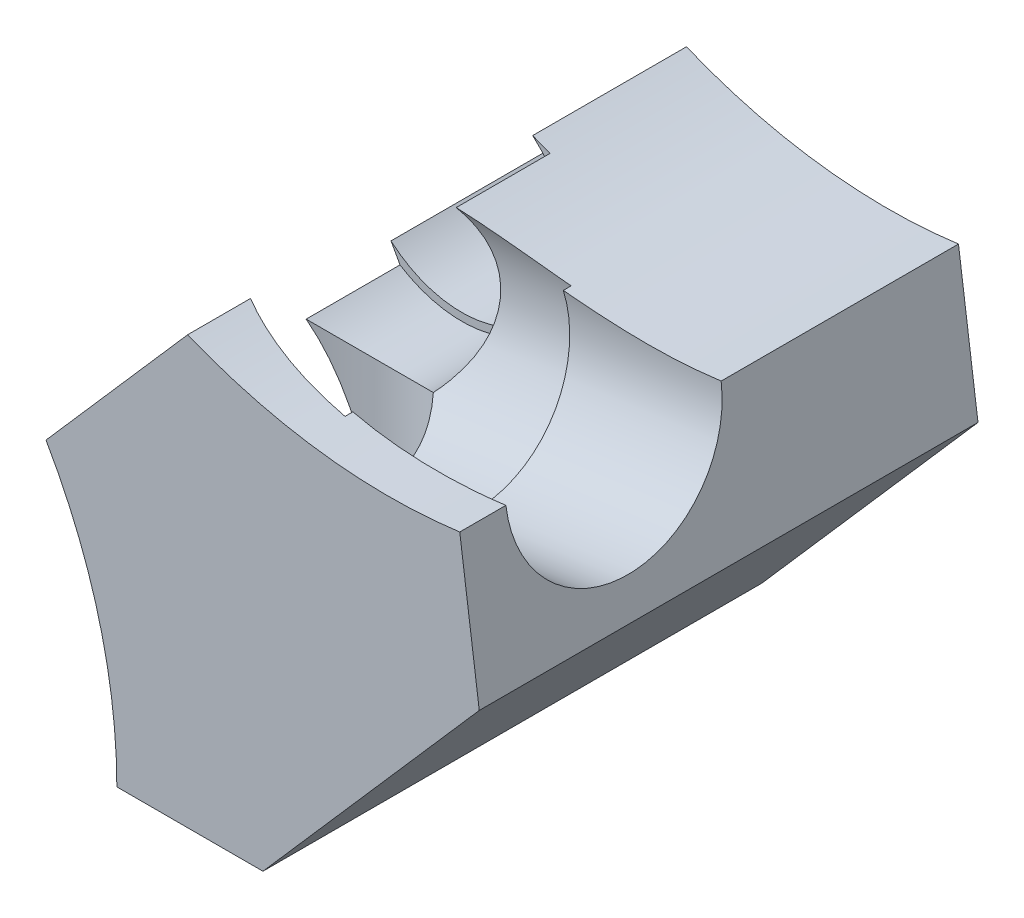
ISO-10303-21;
HEADER;
FILE_DESCRIPTION(('STEP AP214'),'2;1');
FILE_NAME('part.step','',(''),(''),'','','');
FILE_SCHEMA(('AUTOMOTIVE_DESIGN { 1 0 10303 214 1 1 1 1 }'));
ENDSEC;
DATA;
#1=APPLICATION_CONTEXT('core data for automotive mechanical design processes');
#2=APPLICATION_PROTOCOL_DEFINITION('international standard','automotive_design',2000,#1);
#3=PRODUCT_CONTEXT('',#1,'mechanical');
#4=PRODUCT('Part','Part','',(#3));
#5=PRODUCT_RELATED_PRODUCT_CATEGORY('part','',(#4));
#6=PRODUCT_DEFINITION_FORMATION('','',#4);
#7=PRODUCT_DEFINITION_CONTEXT('part definition',#1,'design');
#8=PRODUCT_DEFINITION('design','',#6,#7);
#9=PRODUCT_DEFINITION_SHAPE('','',#8);
#10=(LENGTH_UNIT() NAMED_UNIT(*) SI_UNIT(.MILLI.,.METRE.));
#11=(NAMED_UNIT(*) PLANE_ANGLE_UNIT() SI_UNIT($,.RADIAN.));
#12=(NAMED_UNIT(*) SI_UNIT($,.STERADIAN.) SOLID_ANGLE_UNIT());
#13=UNCERTAINTY_MEASURE_WITH_UNIT(LENGTH_MEASURE(1.E-05),#10,'distance_accuracy_value','');
#14=(GEOMETRIC_REPRESENTATION_CONTEXT(3) GLOBAL_UNCERTAINTY_ASSIGNED_CONTEXT((#13)) GLOBAL_UNIT_ASSIGNED_CONTEXT((#10,
#11,#12)) REPRESENTATION_CONTEXT('',''));
#15=CARTESIAN_POINT('',(0.,0.,0.));
#16=DIRECTION('',(0.,0.,1.));
#17=DIRECTION('',(1.,0.,0.));
#18=AXIS2_PLACEMENT_3D('',#15,#16,#17);
#19=CARTESIAN_POINT('',(-13.3940707922051,62.2917669045597,14.6326106220572));
#20=DIRECTION('',(0.,-1.,0.));
#21=DIRECTION('',(0.,0.,-1.));
#22=AXIS2_PLACEMENT_3D('',#19,#20,#21);
#23=CYLINDRICAL_SURFACE('',#22,15.);
#24=CARTESIAN_POINT('',(-13.3940707922051,62.2917669045588,14.6326106220572));
#25=DIRECTION('',(-0.752857241628755,0.658183844930231,0.));
#26=DIRECTION('',(-0.658183844930231,-0.752857241628755,0.));
#27=AXIS2_PLACEMENT_3D('',#24,#25,#26);
#28=ELLIPSE('',#27,22.7899850711013,15.);
#29=CARTESIAN_POINT('',(-13.3940707922042,62.2917669045598,29.6326106220572));
#30=VERTEX_POINT('',#29);
#31=CARTESIAN_POINT('',(-22.6086446212279,51.7517655217567,26.4686415931847));
#32=VERTEX_POINT('',#31);
#33=EDGE_CURVE('E182',#30,#32,#28,.F.);
#34=ORIENTED_EDGE('',*,*,#33,.F.);
#35=CARTESIAN_POINT('',(1.60592920779491,49.1780487545007,14.6326106220572));
#36=CARTESIAN_POINT('',(1.60592920779501,49.1780487545005,23.4194071864609));
#37=CARTESIAN_POINT('',(-4.60727422780116,54.6099286653931,29.6326106220573));
#38=CARTESIAN_POINT('',(-13.3940707922043,62.2917669045597,29.6326106220572));
#39=(BOUNDED_CURVE() B_SPLINE_CURVE(3,(#35,#36,#37,#38),.UNSPECIFIED.,.F.,
.F.) B_SPLINE_CURVE_WITH_KNOTS((4,4),(0.,1.57079632679487),
.UNSPECIFIED.) CURVE() GEOMETRIC_REPRESENTATION_ITEM() RATIONAL_B_SPLINE_CURVE((1.,
0.804737854124374,0.804737854124374,1.)) REPRESENTATION_ITEM(''));
#40=CARTESIAN_POINT('',(1.60592920779491,49.1780487545007,14.6326106220572));
#41=VERTEX_POINT('',#40);
#42=EDGE_CURVE('E343',#41,#30,#39,.T.);
#43=ORIENTED_EDGE('',*,*,#42,.F.);
#44=CARTESIAN_POINT('',(-2.10121216777219,52.4190092306077,4.75985294810577));
#45=CARTESIAN_POINT('',(0.315301500164727,50.3063772874685,7.52395879545354));
#46=CARTESIAN_POINT('',(1.60592920779509,49.1780487545009,10.9611232609637));
#47=CARTESIAN_POINT('',(1.60592920779491,49.1780487545007,14.6326106220572));
#48=(BOUNDED_CURVE() B_SPLINE_CURVE(3,(#44,#45,#46,#47),.UNSPECIFIED.,.F.,
.F.) B_SPLINE_CURVE_WITH_KNOTS((4,4),(5.56478144772367,6.28318530717959),
.UNSPECIFIED.) CURVE() GEOMETRIC_REPRESENTATION_ITEM() RATIONAL_B_SPLINE_CURVE((1.,
0.957451776798256,0.957451776798256,1.)) REPRESENTATION_ITEM(''));
#49=CARTESIAN_POINT('',(-2.10121216777219,52.4190092306077,4.75985294810577));
#50=VERTEX_POINT('',#49);
#51=EDGE_CURVE('E391',#50,#41,#48,.T.);
#52=ORIENTED_EDGE('',*,*,#51,.F.);
#53=CARTESIAN_POINT('',(-13.3940707922051,47.2917669045597,-0.367389377942728));
#54=CARTESIAN_POINT('',(-8.99778766191862,47.2917669045599,-0.367389377942724));
#55=CARTESIAN_POINT('',(-4.99477470186557,49.1092356397213,1.45007935721872));
#56=CARTESIAN_POINT('',(-2.10121216777219,52.4190092306077,4.75985294810577));
#57=(BOUNDED_CURVE() B_SPLINE_CURVE(3,(#53,#54,#55,#56),.UNSPECIFIED.,.F.,
.F.) B_SPLINE_CURVE_WITH_KNOTS((4,4),(0.,0.852392467338988),
.UNSPECIFIED.) CURVE() GEOMETRIC_REPRESENTATION_ITEM() RATIONAL_B_SPLINE_CURVE((1.,
0.940363232822113,0.940363232822113,1.)) REPRESENTATION_ITEM(''));
#58=CARTESIAN_POINT('',(-13.3940707922051,47.2917669045597,-0.36738937794123));
#59=VERTEX_POINT('',#58);
#60=EDGE_CURVE('E390',#59,#50,#57,.T.);
#61=ORIENTED_EDGE('',*,*,#60,.F.);
#62=CARTESIAN_POINT('',(-13.3940707922051,62.2917669045597,14.6326106220572));
#63=DIRECTION('',(0.,0.707106781186547,-0.707106781186547));
#64=DIRECTION('',(0.,-0.707106781186547,-0.707106781186547));
#65=AXIS2_PLACEMENT_3D('',#62,#63,#64);
#66=ELLIPSE('',#65,21.2132034355964,15.);
#67=CARTESIAN_POINT('',(-21.4352763002352,49.6292626507548,1.97010636825238));
#68=VERTEX_POINT('',#67);
#69=EDGE_CURVE('E388',#68,#59,#66,.F.);
#70=ORIENTED_EDGE('',*,*,#69,.F.);
#71=CARTESIAN_POINT('',(-22.6086446212279,51.7517655217567,2.79657965092977));
#72=CARTESIAN_POINT('',(-22.497305660859,51.5584649721213,2.70990399080437));
#73=CARTESIAN_POINT('',(-22.3863662625454,51.3636874077556,2.62605442565893));
#74=CARTESIAN_POINT('',(-22.1654630328847,50.971378048911,2.4637371655503));
#75=CARTESIAN_POINT('',(-22.0554991240742,50.7738464763895,2.3852690398565));
#76=CARTESIAN_POINT('',(-21.7274208095606,50.1775775529239,2.15758917954709));
#77=CARTESIAN_POINT('',(-21.511005245371,49.774967301797,2.01601360862565));
#78=CARTESIAN_POINT('',(-21.0843020626396,48.9616425290627,1.75149181491057));
#79=CARTESIAN_POINT('',(-20.874003201102,48.5509455552562,1.62850940463872));
#80=CARTESIAN_POINT('',(-20.4599243764826,47.7217042206528,1.3989506956497));
#81=CARTESIAN_POINT('',(-20.2561452329978,47.3031588836425,1.29237645324147));
#82=CARTESIAN_POINT('',(-19.8580629355517,46.4639160789752,1.09504808535267));
#83=CARTESIAN_POINT('',(-19.663679317475,46.0432949716763,1.00413042997038));
#84=CARTESIAN_POINT('',(-19.2825047777737,45.1960680174108,0.835154142728552));
#85=CARTESIAN_POINT('',(-19.0957141186502,44.7694619642195,0.757095955157812));
#86=CARTESIAN_POINT('',(-18.7300895004456,43.9107833320251,0.612426394373202));
#87=CARTESIAN_POINT('',(-18.5512580555866,43.4787090802678,0.545818619455417));
#88=CARTESIAN_POINT('',(-18.2019469766476,42.6097843647507,0.422803703924258));
#89=CARTESIAN_POINT('',(-18.0314670456592,42.1729340714624,0.36639620048421));
#90=CARTESIAN_POINT('',(-17.7274980351042,41.3699061091122,0.271474247942497));
#91=CARTESIAN_POINT('',(-17.5926642619812,41.0044016107723,0.231549220576216));
#92=CARTESIAN_POINT('',(-17.3290686501151,40.2707612929407,0.157302928381071));
#93=CARTESIAN_POINT('',(-17.2003051271107,39.9026262363636,0.1229801025707));
#94=CARTESIAN_POINT('',(-16.9483232080454,39.1621122344979,0.0592008036781349));
#95=CARTESIAN_POINT('',(-16.8251335798368,38.7897214912739,0.0297678541339318));
#96=CARTESIAN_POINT('',(-16.5849970314368,38.0425022593602,-0.0245749986940685));
#97=CARTESIAN_POINT('',(-16.4680516487505,37.6676731955443,-0.0494837915990582));
#98=CARTESIAN_POINT('',(-16.354284538196,37.2917669045596,-0.0723931038194329));
#99=B_SPLINE_CURVE_WITH_KNOTS('',3,(#71,#72,#73,#74,#75,#76,#77,#78,#79,#80,#81,#82,#83,#84,#85,
#86,#87,#88,#89,#90,#91,#92,#93,#94,#95,#96,#97,#98),.UNSPECIFIED.,.F.,.F.,(4,2,2,2,2,2,2,2,2,2,
2,2,2,4),(0.,0.717910663643234,1.43576379846521,2.87073353386964,4.30287343268334,
5.73519266469019,7.15150049011256,8.56785723807266,9.98465826620679,11.4014088883919,
12.5761788902568,13.7506209966783,14.9305588706972,16.110785950613),.UNSPECIFIED.);
#100=CARTESIAN_POINT('',(-16.354284538196,37.2917669045597,-0.0723931038194361));
#101=VERTEX_POINT('',#100);
#102=EDGE_CURVE('E238',#68,#101,#99,.T.);
#103=ORIENTED_EDGE('',*,*,#102,.T.);
#104=CARTESIAN_POINT('',(-13.3940707922051,37.2917669045597,14.6326106220572));
#105=DIRECTION('',(0.,1.,0.));
#106=DIRECTION('',(0.,0.,1.));
#107=AXIS2_PLACEMENT_3D('',#104,#105,#106);
#108=CIRCLE('',#107,15.);
#109=CARTESIAN_POINT('',(-16.354284538196,37.2917669045597,29.3376143479339));
#110=VERTEX_POINT('',#109);
#111=EDGE_CURVE('E373',#101,#110,#108,.F.);
#112=ORIENTED_EDGE('',*,*,#111,.T.);
#113=CARTESIAN_POINT('',(-16.354284538196,37.2917669045597,29.3376143479339));
#114=CARTESIAN_POINT('',(-16.4517083729152,37.613668672389,29.3179994798801));
#115=CARTESIAN_POINT('',(-16.5514584807857,37.9347711177428,29.2969148884973));
#116=CARTESIAN_POINT('',(-16.7555715216863,38.5752843351884,29.2514771845038));
#117=CARTESIAN_POINT('',(-16.8599345940922,38.8946950558395,29.2271239730901));
#118=CARTESIAN_POINT('',(-17.1799089790606,39.8503235565514,29.1486612400396));
#119=CARTESIAN_POINT('',(-17.4023740460625,40.4838339053765,29.089154726895));
#120=CARTESIAN_POINT('',(-17.8629770513617,41.7368485426443,28.9534347693463));
#121=CARTESIAN_POINT('',(-18.1009573133637,42.3564273828486,28.8773752424664));
#122=CARTESIAN_POINT('',(-18.5936664959186,43.5861029207684,28.7050070517067));
#123=CARTESIAN_POINT('',(-18.8483959029861,44.1961993424099,28.6086977994516));
#124=CARTESIAN_POINT('',(-19.3739174746482,45.405953693276,28.3920550878186));
#125=CARTESIAN_POINT('',(-19.6447268521923,46.0055995142332,28.2716955454417));
#126=CARTESIAN_POINT('',(-20.2007722548871,47.1916808290841,28.0028836048905));
#127=CARTESIAN_POINT('',(-20.4860042616835,47.7781199374598,27.854439000365));
#128=CARTESIAN_POINT('',(-20.9245433721976,48.6485636769759,27.6064479882479));
#129=CARTESIAN_POINT('',(-21.0731873883177,48.9384388762387,27.519119751233));
#130=CARTESIAN_POINT('',(-21.3733501824779,49.5138069255417,27.335447618418));
#131=CARTESIAN_POINT('',(-21.5248688090994,49.7993000049829,27.239104196443));
#132=CARTESIAN_POINT('',(-21.8305801947806,50.3657647944101,27.0366013499262));
#133=CARTESIAN_POINT('',(-21.9847755770969,50.6467314802786,26.9304317963177));
#134=CARTESIAN_POINT('',(-22.2952604919742,51.2033676668613,26.7075945243082));
#135=CARTESIAN_POINT('',(-22.4515504248664,51.4790361296945,26.5909247739306));
#136=CARTESIAN_POINT('',(-22.6086446212279,51.7517655217567,26.4686415931847));
#137=B_SPLINE_CURVE_WITH_KNOTS('',3,(#113,#114,#115,#116,#117,#118,#119,#120,#121,#122,#123,
#124,#125,#126,#127,#128,#129,#130,#131,#132,#133,#134,#135,#136),.UNSPECIFIED.,.F.,.F.,(4,2,2,
2,2,2,2,2,2,2,2,4),(0.,1.01065417896845,2.02133891466306,4.04303397786592,6.04667766071157,
8.0503795693896,10.0562664418994,12.0615974919349,13.0732651438277,14.0848796537538,
15.0975488339521,16.1104144069397),.UNSPECIFIED.);
#138=EDGE_CURVE('E254',#110,#32,#137,.T.);
#139=ORIENTED_EDGE('',*,*,#138,.T.);
#140=EDGE_LOOP('',(#34,#43,#52,#61,#70,#103,#112,#139));
#141=FACE_BOUND('',#140,.T.);
#142=ADVANCED_FACE('F34',(#141),#23,.F.);
#143=CARTESIAN_POINT('',(1581.6059292078,277.29176690456,14.6326106220572));
#144=DIRECTION('',(-0.991036947957525,-0.133588052546004,0.));
#145=DIRECTION('',(0.133588052546004,-0.991036947957525,0.));
#146=AXIS2_PLACEMENT_3D('',#143,#144,#145);
#147=CYLINDRICAL_SURFACE('',#146,15.);
#148=CARTESIAN_POINT('',(-4.17949696318075,72.8317682873627,2.79657965093458));
#149=CARTESIAN_POINT('',(-3.97305542154374,72.7472499078718,2.70990399080917));
#150=CARTESIAN_POINT('',(-3.76520348045316,72.6633248206622,2.62605442566371));
#151=CARTESIAN_POINT('',(-3.34690037855786,72.496809401389,2.46373716555504));
#152=CARTESIAN_POINT('',(-3.13644942737286,72.4142189629055,2.38526903986122));
#153=CARTESIAN_POINT('',(-2.50169755018226,72.1687356356785,2.15758917955172));
#154=CARTESIAN_POINT('',(-2.073785381929,72.0080437348368,2.01601360863023));
#155=CARTESIAN_POINT('',(-1.21074803426527,71.693815587416,1.75149181491501));
#156=CARTESIAN_POINT('',(-0.77563874344389,71.5402658544362,1.62850940464308));
#157=CARTESIAN_POINT('',(0.101486041701706,71.240675174852,1.39895069565389));
#158=CARTESIAN_POINT('',(0.543502394001203,71.0946351709088,1.29237645324557));
#159=CARTESIAN_POINT('',(1.42840206060142,70.8122337177007,1.09504808535656));
#160=CARTESIAN_POINT('',(1.87122044801048,70.6757823246928,1.00413042997416));
#161=CARTESIAN_POINT('',(2.7617740274305,70.4112036711128,0.835154142732131));
#162=CARTESIAN_POINT('',(3.20950938875087,70.2830766982383,0.757095955161302));
#163=CARTESIAN_POINT('',(4.10933472038458,70.0354383987523,0.612426394376494));
#164=CARTESIAN_POINT('',(4.56142601258919,69.9159297872879,0.5458186194586));
#165=CARTESIAN_POINT('',(5.46922629742695,69.6858275622834,0.42280370392722));
#166=CARTESIAN_POINT('',(5.92493516077989,69.5752336317231,0.366396200487061));
#167=CARTESIAN_POINT('',(6.76137216986684,69.3812640528588,0.271474247944969));
#168=CARTESIAN_POINT('',(7.1416128135363,69.296465835991,0.231549220578445));
#169=CARTESIAN_POINT('',(7.90389069946986,69.1332384266397,0.157302928382857));
#170=CARTESIAN_POINT('',(8.28592741065445,69.0548074630749,0.122980102572287));
#171=CARTESIAN_POINT('',(9.05346592083025,68.9040078944555,0.0592008036793579));
#172=CARTESIAN_POINT('',(9.43897556897003,68.8316693754686,0.0297678541349905));
#173=CARTESIAN_POINT('',(10.211576809869,68.6935047454649,-0.024574998693298));
#174=CARTESIAN_POINT('',(10.5986687672075,68.6276802350022,-0.0494837915984119));
#175=CARTESIAN_POINT('',(10.9864037172868,68.5651494143325,-0.0723931038188904));
#176=B_SPLINE_CURVE_WITH_KNOTS('',3,(#148,#149,#150,#151,#152,#153,#154,#155,#156,#157,#158,
#159,#160,#161,#162,#163,#164,#165,#166,#167,#168,#169,#170,#171,#172,#173,#174,#175),
.UNSPECIFIED.,.F.,.F.,(4,2,2,2,2,2,2,2,2,2,2,2,2,4),(0.,0.717910663642287,1.43576379846332,
2.87073353386585,4.30287343267766,5.73519266468261,7.15150049010308,8.56785723806128,
9.9846582661935,11.4014088883767,12.5761788902451,13.7506209966702,14.9305588706927,
16.1107859506121),.UNSPECIFIED.);
#177=CARTESIAN_POINT('',(-1.9192702069614,71.9524579527593,1.97010636825891));
#178=VERTEX_POINT('',#177);
#179=CARTESIAN_POINT('',(10.986403717287,68.5651494143325,-0.0723931038189001));
#180=VERTEX_POINT('',#179);
#181=EDGE_CURVE('E317',#178,#180,#176,.T.);
#182=ORIENTED_EDGE('',*,*,#181,.F.);
#183=CARTESIAN_POINT('',(-15.3978915803943,77.1573211239227,14.6326106220572));
#184=CARTESIAN_POINT('',(-5.73479690517173,78.4598699359425,4.8821218081556));
#185=CARTESIAN_POINT('',(1.60592920779494,72.0422557184608,-1.53549240932612));
#186=CARTESIAN_POINT('',(1.60592920779491,62.2917669045597,-0.232943597305246));
#187=(BOUNDED_CURVE() B_SPLINE_CURVE(3,(#183,#184,#185,#186),.UNSPECIFIED.,.F.,
.F.) B_SPLINE_CURVE_WITH_KNOTS((4,4),(1.57079632679492,3.27558126147284),
.UNSPECIFIED.) CURVE() GEOMETRIC_REPRESENTATION_ITEM() RATIONAL_B_SPLINE_CURVE((1.,
0.772122563286756,0.772122563286756,1.)) REPRESENTATION_ITEM(''));
#188=CARTESIAN_POINT('',(1.60592920779491,62.2917669045597,-0.232943597305246));
#189=VERTEX_POINT('',#188);
#190=EDGE_CURVE('E38',#178,#189,#187,.T.);
#191=ORIENTED_EDGE('',*,*,#190,.T.);
#192=CARTESIAN_POINT('',(1.60592920779491,62.2917669045597,-0.232943597305246));
#193=CARTESIAN_POINT('',(1.60592920779495,58.6202795434658,0.257523249210135));
#194=CARTESIAN_POINT('',(0.315301500164592,55.1831150779557,1.99574710075735));
#195=CARTESIAN_POINT('',(-2.10121216777219,52.4190092306077,4.75985294810577));
#196=(BOUNDED_CURVE() B_SPLINE_CURVE(3,(#192,#193,#194,#195),.UNSPECIFIED.,.F.,
.F.) B_SPLINE_CURVE_WITH_KNOTS((4,4),(3.27558126147284,3.99398512092876),
.UNSPECIFIED.) CURVE() GEOMETRIC_REPRESENTATION_ITEM() RATIONAL_B_SPLINE_CURVE((1.,
0.957451776798257,0.957451776798257,1.)) REPRESENTATION_ITEM(''));
#197=EDGE_CURVE('E443',#189,#50,#196,.T.);
#198=ORIENTED_EDGE('',*,*,#197,.T.);
#199=ORIENTED_EDGE('',*,*,#51,.T.);
#200=DIRECTION('',(-0.991036947957526,-0.133588052545999,0.));
#201=VECTOR('',#200,1.);
#202=CARTESIAN_POINT('',(1583.60974999598,262.426212685197,14.6326106220572));
#203=LINE('',#202,#201);
#204=CARTESIAN_POINT('',(13.3856736949228,50.7659139988469,14.6326106220573));
#205=VERTEX_POINT('',#204);
#206=EDGE_CURVE('E474',#205,#41,#203,.T.);
#207=ORIENTED_EDGE('',*,*,#206,.F.);
#208=CARTESIAN_POINT('',(11.3818529067341,65.6314682182014,14.6326106220573));
#209=DIRECTION('',(-0.991036947957527,-0.133588052545987,0.));
#210=DIRECTION('',(0.133588052545987,-0.991036947957527,0.));
#211=AXIS2_PLACEMENT_3D('',#208,#209,#210);
#212=CIRCLE('',#211,15.);
#213=EDGE_CURVE('E395',#205,#180,#212,.F.);
#214=ORIENTED_EDGE('',*,*,#213,.T.);
#215=EDGE_LOOP('',(#182,#191,#198,#199,#207,#214));
#216=FACE_BOUND('',#215,.T.);
#217=ADVANCED_FACE('F266',(#216),#147,.F.);
#218=CARTESIAN_POINT('',(-13.3940707922051,62.2917669045597,14.6326106220572));
#219=DIRECTION('',(0.,0.,-1.));
#220=DIRECTION('',(-1.,0.,0.));
#221=AXIS2_PLACEMENT_3D('',#218,#219,#220);
#222=CYLINDRICAL_SURFACE('',#221,15.);
#223=DIRECTION('',(0.,0.,1.));
#224=VECTOR('',#223,1.);
#225=CARTESIAN_POINT('',(-1.91927020695335,71.9524579527563,2.19983351237598));
#226=LINE('',#225,#224);
#227=CARTESIAN_POINT('',(-1.91927020695335,71.9524579527563,-10.2329435973053));
#228=VERTEX_POINT('',#227);
#229=EDGE_CURVE('E355',#228,#178,#226,.T.);
#230=ORIENTED_EDGE('',*,*,#229,.F.);
#231=CARTESIAN_POINT('',(-13.3940707922051,62.2917669045597,-10.2329435973053));
#232=DIRECTION('',(0.,0.,1.));
#233=DIRECTION('',(1.,0.,0.));
#234=AXIS2_PLACEMENT_3D('',#231,#232,#233);
#235=CIRCLE('',#234,15.);
#236=CARTESIAN_POINT('',(1.60592920779491,62.2917669045597,-10.2329435973053));
#237=VERTEX_POINT('',#236);
#238=EDGE_CURVE('E380',#228,#237,#235,.F.);
#239=ORIENTED_EDGE('',*,*,#238,.T.);
#240=DIRECTION('',(0.,0.,-1.));
#241=VECTOR('',#240,1.);
#242=CARTESIAN_POINT('',(1.60592920779491,62.2917669045597,14.6326106220572));
#243=LINE('',#242,#241);
#244=EDGE_CURVE('E386',#189,#237,#243,.T.);
#245=ORIENTED_EDGE('',*,*,#244,.F.);
#246=ORIENTED_EDGE('',*,*,#190,.F.);
#247=EDGE_LOOP('',(#230,#239,#245,#246));
#248=FACE_BOUND('',#247,.T.);
#249=ADVANCED_FACE('F499',(#248),#222,.F.);
#250=CARTESIAN_POINT('',(1581.6059292078,277.29176690456,14.6326106220572));
#251=DIRECTION('',(-0.991036947957525,-0.133588052546004,0.));
#252=DIRECTION('',(0.133588052546004,-0.991036947957525,0.));
#253=AXIS2_PLACEMENT_3D('',#250,#251,#252);
#254=CYLINDRICAL_SURFACE('',#253,15.);
#255=CARTESIAN_POINT('',(10.9864037172868,68.5651494143325,29.3376143479334));
#256=CARTESIAN_POINT('',(10.6543725114035,68.6186978038756,29.3179994798796));
#257=CARTESIAN_POINT('',(10.3228227013266,68.6746583959955,29.2969148884968));
#258=CARTESIAN_POINT('',(9.66078337354981,68.7913770477396,29.2514771845033));
#259=CARTESIAN_POINT('',(9.33029388821047,68.8521352523622,29.2271239730894));
#260=CARTESIAN_POINT('',(8.34048598053128,69.0415811398985,29.1486612400389));
#261=CARTESIAN_POINT('',(7.68293514287191,69.1774228271602,29.0891547268942));
#262=CARTESIAN_POINT('',(6.37962028253332,69.4665096385481,28.9534347693453));
#263=CARTESIAN_POINT('',(5.73380343997309,69.6195885404153,28.8773752424653));
#264=CARTESIAN_POINT('',(4.44932948772618,69.9436115845513,28.7050070517052));
#265=CARTESIAN_POINT('',(3.81067258664652,70.1145562458543,28.60869779945));
#266=CARTESIAN_POINT('',(2.54155792365689,70.4737588125292,28.3920550878167));
#267=CARTESIAN_POINT('',(1.91110986204281,70.66203539409,28.2716955454396));
#268=CARTESIAN_POINT('',(0.661378433270573,71.0546506398906,28.002883604888));
#269=CARTESIAN_POINT('',(0.0420920208315003,71.2589848389415,27.8544390003624));
#270=CARTESIAN_POINT('',(-0.879133471885886,71.5773124165728,27.6064479882448));
#271=CARTESIAN_POINT('',(-1.18626756928785,71.6859002652897,27.5191197512299));
#272=CARTESIAN_POINT('',(-1.79657672793988,71.9065103875013,27.3354476184145));
#273=CARTESIAN_POINT('',(-2.09975199630697,72.0185324802892,27.2391041964394));
#274=CARTESIAN_POINT('',(-2.70197892100045,72.2458308308552,27.0366013499223));
#275=CARTESIAN_POINT('',(-3.00102594867635,72.3611103595397,26.9304317963136));
#276=CARTESIAN_POINT('',(-3.5941500512732,72.5944524378245,26.7075945243038));
#277=CARTESIAN_POINT('',(-3.88822615109499,72.7125155228164,26.5909247739261));
#278=CARTESIAN_POINT('',(-4.17949696318075,72.8317682873627,26.46864159318));
#279=B_SPLINE_CURVE_WITH_KNOTS('',3,(#255,#256,#257,#258,#259,#260,#261,#262,#263,#264,#265,
#266,#267,#268,#269,#270,#271,#272,#273,#274,#275,#276,#277,#278),.UNSPECIFIED.,.F.,.F.,(4,2,2,
2,2,2,2,2,2,2,2,4),(0.,1.01065417896841,2.02133891466297,4.04303397786574,6.04667766071126,
8.05037956938917,10.0562664418988,12.0615974919342,13.0732651438269,14.084879653753,
15.0975488339513,16.1104144069389),.UNSPECIFIED.);
#280=CARTESIAN_POINT('',(10.986403717287,68.5651494143325,29.3376143479335));
#281=VERTEX_POINT('',#280);
#282=CARTESIAN_POINT('',(-4.1794969631807,72.8317682873626,26.4686415931799));
#283=VERTEX_POINT('',#282);
#284=EDGE_CURVE('E312',#281,#283,#279,.T.);
#285=ORIENTED_EDGE('',*,*,#284,.F.);
#286=CARTESIAN_POINT('',(11.3818529067341,65.6314682182014,14.6326106220573));
#287=DIRECTION('',(-0.991036947957527,-0.133588052545987,0.));
#288=DIRECTION('',(0.133588052545987,-0.991036947957527,0.));
#289=AXIS2_PLACEMENT_3D('',#286,#287,#288);
#290=CIRCLE('',#289,15.);
#291=EDGE_CURVE('E379',#281,#205,#290,.F.);
#292=ORIENTED_EDGE('',*,*,#291,.T.);
#293=ORIENTED_EDGE('',*,*,#206,.T.);
#294=ORIENTED_EDGE('',*,*,#42,.T.);
#295=CARTESIAN_POINT('',(-13.3940707922129,62.2917669045501,14.6326106220573));
#296=DIRECTION('',(-0.752857241628755,0.658183844930231,0.));
#297=DIRECTION('',(-0.658183844930231,-0.752857241628755,0.));
#298=AXIS2_PLACEMENT_3D('',#295,#296,#297);
#299=ELLIPSE('',#298,22.7899850711089,15.);
#300=EDGE_CURVE('E260',#283,#30,#299,.F.);
#301=ORIENTED_EDGE('',*,*,#300,.F.);
#302=EDGE_LOOP('',(#285,#292,#293,#294,#301));
#303=FACE_BOUND('',#302,.T.);
#304=ADVANCED_FACE('F275',(#303),#254,.F.);
#305=CARTESIAN_POINT('',(13.3856736949228,50.7659139988469,-70.3673893779428));
#306=DIRECTION('',(-0.991036947957527,-0.133588052545987,0.));
#307=DIRECTION('',(0.133588052545987,-0.991036947957527,0.));
#308=AXIS2_PLACEMENT_3D('',#305,#306,#307);
#309=PLANE('',#308);
#310=ORIENTED_EDGE('',*,*,#291,.F.);
#311=DIRECTION('',(0.,0.,1.));
#312=VECTOR('',#311,1.);
#313=CARTESIAN_POINT('',(10.9864037172871,68.5651494143325,-30.2329435973053));
#314=LINE('',#313,#312);
#315=CARTESIAN_POINT('',(10.9864037172871,68.5651494143325,28.3160727050987));
#316=VERTEX_POINT('',#315);
#317=EDGE_CURVE('E337',#281,#316,#314,.F.);
#318=ORIENTED_EDGE('',*,*,#317,.T.);
#319=CARTESIAN_POINT('',(11.3818529067342,65.6314682182015,14.6326106220573));
#320=DIRECTION('',(0.991036947957527,0.133588052545987,0.));
#321=DIRECTION('',(-0.133588052545987,0.991036947957527,0.));
#322=AXIS2_PLACEMENT_3D('',#319,#320,#321);
#323=CIRCLE('',#322,14.);
#324=CARTESIAN_POINT('',(10.9864037172871,68.5651494143325,0.949148539015853));
#325=VERTEX_POINT('',#324);
#326=EDGE_CURVE('E405',#316,#325,#323,.T.);
#327=ORIENTED_EDGE('',*,*,#326,.T.);
#328=EDGE_CURVE('E311',#325,#180,#314,.F.);
#329=ORIENTED_EDGE('',*,*,#328,.T.);
#330=ORIENTED_EDGE('',*,*,#213,.F.);
#331=EDGE_LOOP('',(#310,#318,#327,#329,#330));
#332=FACE_BOUND('',#331,.T.);
#333=ADVANCED_FACE('F270',(#332),#309,.T.);
#334=CARTESIAN_POINT('',(-29.3422482935074,77.2917669045596,-10.2329435973053));
#335=DIRECTION('',(0.,0.,1.));
#336=DIRECTION('',(1.,0.,0.));
#337=AXIS2_PLACEMENT_3D('',#334,#335,#336);
#338=PLANE('',#337);
#339=ORIENTED_EDGE('',*,*,#238,.F.);
#340=CARTESIAN_POINT('',(21.9792992542022,136.72719073719,-10.2329435973053));
#341=DIRECTION('',(0.,0.,1.));
#342=DIRECTION('',(1.,0.,0.));
#343=AXIS2_PLACEMENT_3D('',#340,#341,#342);
#344=CIRCLE('',#343,69.042795638535);
#345=CARTESIAN_POINT('',(-4.1794969631807,72.8317682873626,-10.2329435973053));
#346=VERTEX_POINT('',#345);
#347=EDGE_CURVE('E357',#228,#346,#344,.F.);
#348=ORIENTED_EDGE('',*,*,#347,.T.);
#349=CARTESIAN_POINT('',(-13.3940707922051,62.2917669045597,-10.2329435973053));
#350=DIRECTION('',(0.,0.,-1.));
#351=DIRECTION('',(-1.,0.,0.));
#352=AXIS2_PLACEMENT_3D('',#349,#350,#351);
#353=CIRCLE('',#352,14.);
#354=CARTESIAN_POINT('',(-22.6086446212279,51.7517655217567,-10.2329435973053));
#355=VERTEX_POINT('',#354);
#356=EDGE_CURVE('E397',#346,#355,#353,.T.);
#357=ORIENTED_EDGE('',*,*,#356,.T.);
#358=CARTESIAN_POINT('',(-82.4368664307895,17.2917669045597,-10.2329435973053));
#359=DIRECTION('',(0.,0.,1.));
#360=DIRECTION('',(1.,0.,0.));
#361=AXIS2_PLACEMENT_3D('',#358,#359,#360);
#362=CIRCLE('',#361,69.0427956385844);
#363=CARTESIAN_POINT('',(-21.4352763002352,49.6292626507548,-10.2329435973053));
#364=VERTEX_POINT('',#363);
#365=EDGE_CURVE('E253',#364,#355,#362,.T.);
#366=ORIENTED_EDGE('',*,*,#365,.F.);
#367=EDGE_CURVE('E376',#237,#364,#235,.F.);
#368=ORIENTED_EDGE('',*,*,#367,.F.);
#369=EDGE_LOOP('',(#339,#348,#357,#366,#368));
#370=FACE_BOUND('',#369,.T.);
#371=ADVANCED_FACE('F274',(#370),#338,.T.);
#372=CARTESIAN_POINT('',(-13.3940707922051,62.2917669045597,-30.2329435973052));
#373=DIRECTION('',(0.,0.,1.));
#374=DIRECTION('',(1.,0.,0.));
#375=AXIS2_PLACEMENT_3D('',#372,#373,#374);
#376=CYLINDRICAL_SURFACE('',#375,14.);
#377=ORIENTED_EDGE('',*,*,#356,.F.);
#378=DIRECTION('',(0.,0.,1.));
#379=VECTOR('',#378,1.);
#380=CARTESIAN_POINT('',(-4.1794969631807,72.8317682873626,-30.2329435973053));
#381=LINE('',#380,#379);
#382=CARTESIAN_POINT('',(-4.1794969631807,72.8317682873626,-30.2329435973053));
#383=VERTEX_POINT('',#382);
#384=EDGE_CURVE('E208',#383,#346,#381,.T.);
#385=ORIENTED_EDGE('',*,*,#384,.F.);
#386=CARTESIAN_POINT('',(-13.3940707922051,62.2917669045597,-30.2329435973052));
#387=DIRECTION('',(0.,0.,-1.));
#388=DIRECTION('',(-1.,0.,0.));
#389=AXIS2_PLACEMENT_3D('',#386,#387,#388);
#390=CIRCLE('',#389,14.);
#391=CARTESIAN_POINT('',(-22.6086446212279,51.7517655217567,-30.2329435973052));
#392=VERTEX_POINT('',#391);
#393=EDGE_CURVE('E400',#383,#392,#390,.T.);
#394=ORIENTED_EDGE('',*,*,#393,.T.);
#395=DIRECTION('',(0.,0.,1.));
#396=VECTOR('',#395,1.);
#397=CARTESIAN_POINT('',(-22.6086446212279,51.7517655217567,-30.2329435973053));
#398=LINE('',#397,#396);
#399=EDGE_CURVE('E52',#392,#355,#398,.T.);
#400=ORIENTED_EDGE('',*,*,#399,.T.);
#401=EDGE_LOOP('',(#377,#385,#394,#400));
#402=FACE_BOUND('',#401,.T.);
#403=ADVANCED_FACE('F284',(#402),#376,.F.);
#404=CARTESIAN_POINT('',(31.2025918658847,68.3032292691213,14.6326106220573));
#405=DIRECTION('',(-0.991036947957527,-0.133588052545987,0.));
#406=DIRECTION('',(0.133588052545987,-0.991036947957527,0.));
#407=AXIS2_PLACEMENT_3D('',#404,#405,#406);
#408=CYLINDRICAL_SURFACE('',#407,14.);
#409=CARTESIAN_POINT('',(31.2025918658847,68.3032292691213,14.6326106220573));
#410=DIRECTION('',(-0.991036947957527,-0.133588052545987,0.));
#411=DIRECTION('',(0.133588052545987,-0.991036947957527,0.));
#412=AXIS2_PLACEMENT_3D('',#409,#410,#411);
#413=CIRCLE('',#412,14.);
#414=CARTESIAN_POINT('',(31.2025918658847,68.3032292691213,0.632610622057318));
#415=VERTEX_POINT('',#414);
#416=CARTESIAN_POINT('',(31.2025918658847,68.3032292691213,28.6326106220573));
#417=VERTEX_POINT('',#416);
#418=EDGE_CURVE('E409',#415,#417,#413,.T.);
#419=ORIENTED_EDGE('',*,*,#418,.F.);
#420=CARTESIAN_POINT('',(31.2025918658847,68.3032292691213,0.632610622057318));
#421=CARTESIAN_POINT('',(30.7823801713162,68.2465863544398,0.632615775320988));
#422=CARTESIAN_POINT('',(30.3616565264879,68.1938157701723,0.632609930893877));
#423=CARTESIAN_POINT('',(29.5193084162037,68.0960339714374,0.632621119895822));
#424=CARTESIAN_POINT('',(29.0976839505445,68.0510227587203,0.632638153330038));
#425=CARTESIAN_POINT('',(27.8316899709077,67.9276547347114,0.63279087481251));
#426=CARTESIAN_POINT('',(26.9861542989141,67.860957394634,0.633028174871544));
#427=CARTESIAN_POINT('',(25.2979305050561,67.7590422371294,0.634696849517829));
#428=CARTESIAN_POINT('',(24.4552526977559,67.7236514160677,0.636121576183156));
#429=CARTESIAN_POINT('',(22.7691538882696,67.6837633551746,0.641692715091178));
#430=CARTESIAN_POINT('',(21.9257328759338,67.6792665439967,0.645839165096835));
#431=CARTESIAN_POINT('',(20.2392799078161,67.7011725350387,0.65899167453948));
#432=CARTESIAN_POINT('',(19.396247980428,67.7275773173084,0.667998045360708));
#433=CARTESIAN_POINT('',(17.7118313644026,67.8112470014873,0.6936132920846));
#434=CARTESIAN_POINT('',(16.8704466108745,67.8685106621072,0.710221862186972));
#435=CARTESIAN_POINT('',(15.6082683704906,67.9776647880652,0.743440581526169));
#436=CARTESIAN_POINT('',(15.1863435672428,68.0180720501943,0.755944583626334));
#437=CARTESIAN_POINT('',(14.3434150386127,68.1066363837073,0.784233720182329));
#438=CARTESIAN_POINT('',(13.9224113056179,68.1547933907944,0.800018827416362));
#439=CARTESIAN_POINT('',(13.0814562624207,68.2588364179491,0.835404795678985));
#440=CARTESIAN_POINT('',(12.6615051172129,68.3147235809509,0.855006221140337));
#441=CARTESIAN_POINT('',(11.8229147086936,68.4341829372909,0.898620068675307));
#442=CARTESIAN_POINT('',(11.4042754864995,68.4977553690725,0.922632627620977));
#443=CARTESIAN_POINT('',(10.9864037172871,68.5651494143325,0.94914853901585));
#444=B_SPLINE_CURVE_WITH_KNOTS('',3,(#420,#421,#422,#423,#424,#425,#426,#427,#428,#429,#430,
#431,#432,#433,#434,#435,#436,#437,#438,#439,#440,#441,#442,#443),.UNSPECIFIED.,.F.,.F.,(4,2,2,
2,2,2,2,2,2,2,2,4),(0.,1.27199853957556,2.54399736607558,5.08785714139184,7.61756980031193,
10.1473175588541,12.6772274223271,15.20703552851,16.4790853446457,17.7511246076,
19.0233521480386,20.2956191708043),.UNSPECIFIED.);
#445=EDGE_CURVE('E303',#415,#325,#444,.T.);
#446=ORIENTED_EDGE('',*,*,#445,.T.);
#447=ORIENTED_EDGE('',*,*,#326,.F.);
#448=CARTESIAN_POINT('',(10.9864037172871,68.5651494143325,28.3160727050987));
#449=CARTESIAN_POINT('',(11.4042754864995,68.4977553690725,28.3425886164936));
#450=CARTESIAN_POINT('',(11.8229147086936,68.4341829372909,28.3666011754393));
#451=CARTESIAN_POINT('',(12.6615051172129,68.3147235809509,28.4102150229742));
#452=CARTESIAN_POINT('',(13.0814562624206,68.2588364179491,28.4298164484356));
#453=CARTESIAN_POINT('',(13.9224113056179,68.1547933907944,28.4652024166982));
#454=CARTESIAN_POINT('',(14.3434150386127,68.1066363837073,28.4809875239322));
#455=CARTESIAN_POINT('',(15.1863435672428,68.0180720501943,28.5092766604882));
#456=CARTESIAN_POINT('',(15.6082683704905,67.9776647880652,28.5217806625884));
#457=CARTESIAN_POINT('',(16.8704466108745,67.8685106621072,28.5549993819276));
#458=CARTESIAN_POINT('',(17.7118313644026,67.8112470014873,28.57160795203));
#459=CARTESIAN_POINT('',(19.3962479804279,67.7275773173084,28.5972231987539));
#460=CARTESIAN_POINT('',(20.2392799078161,67.7011725350387,28.6062295695751));
#461=CARTESIAN_POINT('',(21.9257328759338,67.6792665439967,28.6193820790177));
#462=CARTESIAN_POINT('',(22.7691538882695,67.6837633551746,28.6235285290234));
#463=CARTESIAN_POINT('',(24.4552526977559,67.7236514160677,28.6290996679314));
#464=CARTESIAN_POINT('',(25.297930505056,67.7590422371294,28.6305243945967));
#465=CARTESIAN_POINT('',(26.986154298914,67.860957394634,28.632193069243));
#466=CARTESIAN_POINT('',(27.8316899709077,67.9276547347113,28.6324303693021));
#467=CARTESIAN_POINT('',(29.0976839505445,68.0510227587203,28.6325830907845));
#468=CARTESIAN_POINT('',(29.5193084162036,68.0960339714374,28.6326001242187));
#469=CARTESIAN_POINT('',(30.3616565264878,68.1938157701723,28.6326113132207));
#470=CARTESIAN_POINT('',(30.7823801713161,68.2465863544398,28.6326054687937));
#471=CARTESIAN_POINT('',(31.2025918658847,68.3032292691213,28.6326106220574));
#472=B_SPLINE_CURVE_WITH_KNOTS('',3,(#448,#449,#450,#451,#452,#453,#454,#455,#456,#457,#458,
#459,#460,#461,#462,#463,#464,#465,#466,#467,#468,#469,#470,#471),.UNSPECIFIED.,.F.,.F.,(4,2,2,
2,2,2,2,2,2,2,2,4),(0.,1.27226702276564,2.54449456320424,3.81653382615857,5.08858364229426,
7.61839174847719,10.1483016119501,12.6780493704923,15.2077620294124,17.7516218047286,
19.0236206312286,20.2956191708042),.UNSPECIFIED.);
#473=EDGE_CURVE('E295',#316,#417,#472,.T.);
#474=ORIENTED_EDGE('',*,*,#473,.T.);
#475=EDGE_LOOP('',(#419,#446,#447,#474));
#476=FACE_BOUND('',#475,.T.);
#477=ADVANCED_FACE('F287',(#476),#408,.F.);
#478=CARTESIAN_POINT('',(39.6884697109233,5.34985641871334,-50.));
#479=DIRECTION('',(-0.991036947957527,-0.133588052545987,0.));
#480=DIRECTION('',(0.133588052545987,-0.991036947957527,0.));
#481=AXIS2_PLACEMENT_3D('',#478,#479,#480);
#482=PLANE('',#481);
#483=DIRECTION('',(0.,0.,1.));
#484=VECTOR('',#483,1.);
#485=CARTESIAN_POINT('',(31.2025918658847,68.3032292691213,-30.2329435973053));
#486=LINE('',#485,#484);
#487=CARTESIAN_POINT('',(31.2025918658847,68.3032292691213,34.6326106220572));
#488=VERTEX_POINT('',#487);
#489=EDGE_CURVE('E207',#417,#488,#486,.T.);
#490=ORIENTED_EDGE('',*,*,#489,.T.);
#491=DIRECTION('',(0.133588052545987,-0.991036947957527,0.));
#492=VECTOR('',#491,1.);
#493=CARTESIAN_POINT('',(39.6884697109233,5.34985641871331,34.6326106220572));
#494=LINE('',#493,#492);
#495=CARTESIAN_POINT('',(33.7407648642585,49.4735272579283,34.6326106220572));
#496=VERTEX_POINT('',#495);
#497=EDGE_CURVE('E364',#488,#496,#494,.T.);
#498=ORIENTED_EDGE('',*,*,#497,.T.);
#499=DIRECTION('',(0.,0.,1.));
#500=VECTOR('',#499,1.);
#501=CARTESIAN_POINT('',(33.7407648642585,49.4735272579283,-30.2329435973053));
#502=LINE('',#501,#500);
#503=CARTESIAN_POINT('',(33.7407648642585,49.4735272579283,-30.2329435973053));
#504=VERTEX_POINT('',#503);
#505=EDGE_CURVE('E369',#504,#496,#502,.T.);
#506=ORIENTED_EDGE('',*,*,#505,.F.);
#507=DIRECTION('',(-0.133588052545987,0.991036947957527,0.));
#508=VECTOR('',#507,1.);
#509=CARTESIAN_POINT('',(39.6884697109233,5.34985641871334,-30.2329435973053));
#510=LINE('',#509,#508);
#511=CARTESIAN_POINT('',(31.2025918658847,68.3032292691213,-30.2329435973052));
#512=VERTEX_POINT('',#511);
#513=EDGE_CURVE('E44',#504,#512,#510,.T.);
#514=ORIENTED_EDGE('',*,*,#513,.T.);
#515=EDGE_CURVE('E60',#512,#415,#486,.T.);
#516=ORIENTED_EDGE('',*,*,#515,.T.);
#517=ORIENTED_EDGE('',*,*,#418,.T.);
#518=EDGE_LOOP('',(#490,#498,#506,#514,#516,#517));
#519=FACE_BOUND('',#518,.T.);
#520=ADVANCED_FACE('F291',(#519),#482,.F.);
#521=CARTESIAN_POINT('',(-50.,100.,-30.2329435973052));
#522=DIRECTION('',(0.,0.,1.));
#523=DIRECTION('',(0.,-1.,0.));
#524=AXIS2_PLACEMENT_3D('',#521,#522,#523);
#525=PLANE('',#524);
#526=CARTESIAN_POINT('',(21.9792992542022,136.72719073719,-30.2329435973053));
#527=DIRECTION('',(0.,0.,1.));
#528=DIRECTION('',(1.,0.,0.));
#529=AXIS2_PLACEMENT_3D('',#526,#527,#528);
#530=CIRCLE('',#529,69.042795638535);
#531=EDGE_CURVE('E203',#512,#383,#530,.F.);
#532=ORIENTED_EDGE('',*,*,#531,.F.);
#533=ORIENTED_EDGE('',*,*,#513,.F.);
#534=DIRECTION('',(-0.658183844930231,-0.752857241628755,0.));
#535=VECTOR('',#534,1.);
#536=CARTESIAN_POINT('',(5.60592920779493,17.2917669045596,-30.2329435973053));
#537=LINE('',#536,#535);
#538=CARTESIAN_POINT('',(5.60592920779489,17.2917669045596,-30.2329435973053));
#539=VERTEX_POINT('',#538);
#540=EDGE_CURVE('E366',#504,#539,#537,.T.);
#541=ORIENTED_EDGE('',*,*,#540,.T.);
#542=DIRECTION('',(1.,0.,0.));
#543=VECTOR('',#542,1.);
#544=CARTESIAN_POINT('',(-50.,17.2917669045596,-30.2329435973053));
#545=LINE('',#544,#543);
#546=CARTESIAN_POINT('',(-13.3940707922051,17.2917669045596,-30.2329435973053));
#547=VERTEX_POINT('',#546);
#548=EDGE_CURVE('E411',#547,#539,#545,.T.);
#549=ORIENTED_EDGE('',*,*,#548,.F.);
#550=CARTESIAN_POINT('',(-82.4368664307895,17.2917669045597,-30.2329435973053));
#551=DIRECTION('',(0.,0.,1.));
#552=DIRECTION('',(1.,0.,0.));
#553=AXIS2_PLACEMENT_3D('',#550,#551,#552);
#554=CIRCLE('',#553,69.0427956385844);
#555=EDGE_CURVE('E199',#547,#392,#554,.T.);
#556=ORIENTED_EDGE('',*,*,#555,.T.);
#557=ORIENTED_EDGE('',*,*,#393,.F.);
#558=EDGE_LOOP('',(#532,#533,#541,#549,#556,#557));
#559=FACE_BOUND('',#558,.T.);
#560=ADVANCED_FACE('F36',(#559),#525,.F.);
#561=CARTESIAN_POINT('',(-42.5186334530135,91.5463239798469,34.6326106220572));
#562=DIRECTION('',(0.,0.,-1.));
#563=DIRECTION('',(0.,1.,0.));
#564=AXIS2_PLACEMENT_3D('',#561,#562,#563);
#565=PLANE('',#564);
#566=CARTESIAN_POINT('',(21.9792992542022,136.72719073719,34.6326106220572));
#567=DIRECTION('',(0.,0.,1.));
#568=DIRECTION('',(1.,0.,0.));
#569=AXIS2_PLACEMENT_3D('',#566,#567,#568);
#570=CIRCLE('',#569,69.042795638535);
#571=CARTESIAN_POINT('',(-4.1794969631807,72.8317682873626,34.6326106220572));
#572=VERTEX_POINT('',#571);
#573=EDGE_CURVE('E197',#488,#572,#570,.F.);
#574=ORIENTED_EDGE('',*,*,#573,.T.);
#575=DIRECTION('',(-0.658183844930231,-0.752857241628755,0.));
#576=VECTOR('',#575,1.);
#577=CARTESIAN_POINT('',(-38.4584005904866,33.6221750563908,34.6326106220572));
#578=LINE('',#577,#576);
#579=CARTESIAN_POINT('',(-22.6086446212279,51.7517655217567,34.6326106220572));
#580=VERTEX_POINT('',#579);
#581=EDGE_CURVE('E179',#572,#580,#578,.T.);
#582=ORIENTED_EDGE('',*,*,#581,.T.);
#583=CARTESIAN_POINT('',(-82.4368664307895,17.2917669045597,34.6326106220572));
#584=DIRECTION('',(0.,0.,1.));
#585=DIRECTION('',(1.,0.,0.));
#586=AXIS2_PLACEMENT_3D('',#583,#584,#585);
#587=CIRCLE('',#586,69.0427956385844);
#588=CARTESIAN_POINT('',(-13.3940707922051,17.2917669045596,34.6326106220572));
#589=VERTEX_POINT('',#588);
#590=EDGE_CURVE('E188',#589,#580,#587,.T.);
#591=ORIENTED_EDGE('',*,*,#590,.F.);
#592=DIRECTION('',(1.,0.,0.));
#593=VECTOR('',#592,1.);
#594=CARTESIAN_POINT('',(-42.5186334530135,17.2917669045596,34.6326106220572));
#595=LINE('',#594,#593);
#596=CARTESIAN_POINT('',(5.60592920779493,17.2917669045596,34.6326106220572));
#597=VERTEX_POINT('',#596);
#598=EDGE_CURVE('E360',#589,#597,#595,.T.);
#599=ORIENTED_EDGE('',*,*,#598,.T.);
#600=DIRECTION('',(-0.658183844930231,-0.752857241628755,0.));
#601=VECTOR('',#600,1.);
#602=CARTESIAN_POINT('',(5.60592920779492,17.2917669045596,34.6326106220572));
#603=LINE('',#602,#601);
#604=EDGE_CURVE('E11',#496,#597,#603,.T.);
#605=ORIENTED_EDGE('',*,*,#604,.F.);
#606=ORIENTED_EDGE('',*,*,#497,.F.);
#607=EDGE_LOOP('',(#574,#582,#591,#599,#605,#606));
#608=FACE_BOUND('',#607,.T.);
#609=ADVANCED_FACE('F195',(#608),#565,.F.);
#610=ORIENTED_EDGE('',*,*,#367,.T.);
#611=DIRECTION('',(0.,0.,1.));
#612=VECTOR('',#611,1.);
#613=CARTESIAN_POINT('',(-21.4352763002352,49.6292626507548,2.19983351237598));
#614=LINE('',#613,#612);
#615=EDGE_CURVE('E439',#364,#68,#614,.T.);
#616=ORIENTED_EDGE('',*,*,#615,.T.);
#617=ORIENTED_EDGE('',*,*,#69,.T.);
#618=ORIENTED_EDGE('',*,*,#60,.T.);
#619=ORIENTED_EDGE('',*,*,#197,.F.);
#620=ORIENTED_EDGE('',*,*,#244,.T.);
#621=EDGE_LOOP('',(#610,#616,#617,#618,#619,#620));
#622=FACE_BOUND('',#621,.T.);
#623=ADVANCED_FACE('F280',(#622),#222,.F.);
#624=CARTESIAN_POINT('',(1.60592920779491,37.2917669045597,-70.3673893779428));
#625=DIRECTION('',(0.,1.,0.));
#626=DIRECTION('',(0.,0.,1.));
#627=AXIS2_PLACEMENT_3D('',#624,#625,#626);
#628=PLANE('',#627);
#629=DIRECTION('',(0.,0.,1.));
#630=VECTOR('',#629,1.);
#631=CARTESIAN_POINT('',(-16.354284538196,37.2917669045597,-30.2329435973053));
#632=LINE('',#631,#630);
#633=CARTESIAN_POINT('',(-16.354284538196,37.2917669045597,28.3160727050992));
#634=VERTEX_POINT('',#633);
#635=EDGE_CURVE('E252',#110,#634,#632,.F.);
#636=ORIENTED_EDGE('',*,*,#635,.F.);
#637=ORIENTED_EDGE('',*,*,#111,.F.);
#638=CARTESIAN_POINT('',(-16.354284538196,37.2917669045597,0.949148539015265));
#639=VERTEX_POINT('',#638);
#640=EDGE_CURVE('E219',#639,#101,#632,.F.);
#641=ORIENTED_EDGE('',*,*,#640,.F.);
#642=CARTESIAN_POINT('',(-13.3940707922051,37.2917669045597,14.6326106220572));
#643=DIRECTION('',(0.,-1.,0.));
#644=DIRECTION('',(0.,0.,-1.));
#645=AXIS2_PLACEMENT_3D('',#642,#643,#644);
#646=CIRCLE('',#645,14.);
#647=EDGE_CURVE('E401',#639,#634,#646,.T.);
#648=ORIENTED_EDGE('',*,*,#647,.T.);
#649=EDGE_LOOP('',(#636,#637,#641,#648));
#650=FACE_BOUND('',#649,.T.);
#651=ADVANCED_FACE('F277',(#650),#628,.T.);
#652=CARTESIAN_POINT('',(-13.3940707922051,17.2917669045596,14.6326106220572));
#653=DIRECTION('',(0.,1.,0.));
#654=DIRECTION('',(0.,0.,1.));
#655=AXIS2_PLACEMENT_3D('',#652,#653,#654);
#656=CYLINDRICAL_SURFACE('',#655,14.);
#657=CARTESIAN_POINT('',(-16.354284538196,37.2917669045597,28.3160727050992));
#658=CARTESIAN_POINT('',(-16.2316718734081,36.8866435810212,28.342588616494));
#659=CARTESIAN_POINT('',(-16.1127440462288,36.48024916132,28.3666011754397));
#660=CARTESIAN_POINT('',(-15.882329750759,35.6651334250464,28.4102150229746));
#661=CARTESIAN_POINT('',(-15.770843051655,35.2564121810762,28.4298164484359));
#662=CARTESIAN_POINT('',(-15.555391021068,34.436893567075,28.4652024166985));
#663=CARTESIAN_POINT('',(-15.4514245789364,34.0260965132423,28.4809875239325));
#664=CARTESIAN_POINT('',(-15.2510488715788,33.2025543337215,28.5092766604884));
#665=CARTESIAN_POINT('',(-15.1546396690564,32.7898091918998,28.5217806625886));
#666=CARTESIAN_POINT('',(-14.8778519641114,31.5535256078853,28.5549993819277));
#667=CARTESIAN_POINT('',(-14.7087026099962,30.7273319705947,28.5716079520301));
#668=CARTESIAN_POINT('',(-14.4007649261402,29.0691901385266,28.5972231987539));
#669=CARTESIAN_POINT('',(-14.2619778178944,28.2372417136184,28.6062295695751));
#670=CARTESIAN_POINT('',(-14.0149782036691,26.5688308899035,28.6193820790178));
#671=CARTESIAN_POINT('',(-13.9067637391803,25.7323687837471,28.6235285290234));
#672=CARTESIAN_POINT('',(-13.7210516249485,24.0560539972644,28.6290996679314));
#673=CARTESIAN_POINT('',(-13.6435535490382,23.2162013641425,28.6305243945967));
#674=CARTESIAN_POINT('',(-13.519028706799,21.5294945605923,28.632193069243));
#675=CARTESIAN_POINT('',(-13.4721747713664,20.6826275010595,28.6324303693021));
#676=CARTESIAN_POINT('',(-13.4253153710812,19.4115001972739,28.6325830907845));
#677=CARTESIAN_POINT('',(-13.413599154683,18.9876418133932,28.6326001242187));
#678=CARTESIAN_POINT('',(-13.3979768864484,18.1397812329919,28.6326113132207));
#679=CARTESIAN_POINT('',(-13.3940708328502,17.7157790365038,28.6326054687936));
#680=CARTESIAN_POINT('',(-13.3940707922051,17.2917669045597,28.6326106220574));
#681=B_SPLINE_CURVE_WITH_KNOTS('',3,(#657,#658,#659,#660,#661,#662,#663,#664,#665,#666,#667,
#668,#669,#670,#671,#672,#673,#674,#675,#676,#677,#678,#679,#680),.UNSPECIFIED.,.F.,.F.,(4,2,2,
2,2,2,2,2,2,2,2,4),(0.,1.2722670227656,2.54449456320418,3.81653382615847,5.08858364229413,
7.61839174847702,10.1483016119499,12.678049370492,15.2077620294121,17.7516218047283,
19.0236206312283,20.2956191708038),.UNSPECIFIED.);
#682=CARTESIAN_POINT('',(-13.3940707922051,17.2917669045596,28.6326106220572));
#683=VERTEX_POINT('',#682);
#684=EDGE_CURVE('E246',#634,#683,#681,.T.);
#685=ORIENTED_EDGE('',*,*,#684,.F.);
#686=ORIENTED_EDGE('',*,*,#647,.F.);
#687=CARTESIAN_POINT('',(-13.3940707922051,17.2917669045596,0.632610622057215));
#688=CARTESIAN_POINT('',(-13.3940708328502,17.7157790365037,0.632615775320884));
#689=CARTESIAN_POINT('',(-13.3979768864484,18.1397812329919,0.632609930893773));
#690=CARTESIAN_POINT('',(-13.4135991546831,18.9876418133932,0.632621119895715));
#691=CARTESIAN_POINT('',(-13.4253153710812,19.4115001972738,0.63263815332993));
#692=CARTESIAN_POINT('',(-13.4721747713664,20.6826275010595,0.6327908748124));
#693=CARTESIAN_POINT('',(-13.519028706799,21.5294945605922,0.633028174871436));
#694=CARTESIAN_POINT('',(-13.6435535490382,23.2162013641424,0.634696849517721));
#695=CARTESIAN_POINT('',(-13.7210516249485,24.0560539972643,0.636121576183045));
#696=CARTESIAN_POINT('',(-13.9067637391802,25.732368783747,0.641692715091058));
#697=CARTESIAN_POINT('',(-14.0149782036691,26.5688308899034,0.645839165096709));
#698=CARTESIAN_POINT('',(-14.2619778178944,28.2372417136183,0.658991674539333));
#699=CARTESIAN_POINT('',(-14.4007649261402,29.0691901385265,0.667998045360545));
#700=CARTESIAN_POINT('',(-14.7087026099962,30.7273319705946,0.6936132920844));
#701=CARTESIAN_POINT('',(-14.8778519641114,31.5535256078853,0.71022186218675));
#702=CARTESIAN_POINT('',(-15.1546396690564,32.7898091918997,0.743440581525896));
#703=CARTESIAN_POINT('',(-15.2510488715788,33.2025543337214,0.755944583626042));
#704=CARTESIAN_POINT('',(-15.4514245789364,34.0260965132423,0.784233720181993));
#705=CARTESIAN_POINT('',(-15.555391021068,34.436893567075,0.800018827416004));
#706=CARTESIAN_POINT('',(-15.770843051655,35.2564121810761,0.835404795678574));
#707=CARTESIAN_POINT('',(-15.882329750759,35.6651334250464,0.855006221139895));
#708=CARTESIAN_POINT('',(-16.1127440462288,36.48024916132,0.898620068674798));
#709=CARTESIAN_POINT('',(-16.2316718734081,36.8866435810212,0.922632627620432));
#710=CARTESIAN_POINT('',(-16.354284538196,37.2917669045597,0.949148539015266));
#711=B_SPLINE_CURVE_WITH_KNOTS('',3,(#687,#688,#689,#690,#691,#692,#693,#694,#695,#696,#697,
#698,#699,#700,#701,#702,#703,#704,#705,#706,#707,#708,#709,#710),.UNSPECIFIED.,.F.,.F.,(4,2,2,
2,2,2,2,2,2,2,2,4),(0.,1.27199853957553,2.54399736607552,5.08785714139172,7.61756980031177,
10.1473175588539,12.6772274223268,15.2070355285097,16.4790853446454,17.7511246075997,
19.0233521480382,20.2956191708039),.UNSPECIFIED.);
#712=CARTESIAN_POINT('',(-13.3940707922051,17.2917669045596,0.632610622057214));
#713=VERTEX_POINT('',#712);
#714=EDGE_CURVE('E206',#713,#639,#711,.T.);
#715=ORIENTED_EDGE('',*,*,#714,.F.);
#716=CARTESIAN_POINT('',(-13.3940707922051,17.2917669045596,14.6326106220572));
#717=DIRECTION('',(0.,1.,0.));
#718=DIRECTION('',(-1.,0.,0.));
#719=AXIS2_PLACEMENT_3D('',#716,#717,#718);
#720=CIRCLE('',#719,14.);
#721=EDGE_CURVE('E404',#683,#713,#720,.T.);
#722=ORIENTED_EDGE('',*,*,#721,.F.);
#723=EDGE_LOOP('',(#685,#686,#715,#722));
#724=FACE_BOUND('',#723,.T.);
#725=ADVANCED_FACE('F221',(#724),#656,.F.);
#726=CARTESIAN_POINT('',(0.,17.2917669045596,-50.));
#727=DIRECTION('',(0.,1.,0.));
#728=DIRECTION('',(-1.,0.,0.));
#729=AXIS2_PLACEMENT_3D('',#726,#727,#728);
#730=PLANE('',#729);
#731=ORIENTED_EDGE('',*,*,#598,.F.);
#732=DIRECTION('',(0.,0.,1.));
#733=VECTOR('',#732,1.);
#734=CARTESIAN_POINT('',(-13.3940707922051,17.2917669045596,-30.2329435973053));
#735=LINE('',#734,#733);
#736=EDGE_CURVE('E191',#683,#589,#735,.T.);
#737=ORIENTED_EDGE('',*,*,#736,.F.);
#738=ORIENTED_EDGE('',*,*,#721,.T.);
#739=EDGE_CURVE('E185',#547,#713,#735,.T.);
#740=ORIENTED_EDGE('',*,*,#739,.F.);
#741=ORIENTED_EDGE('',*,*,#548,.T.);
#742=DIRECTION('',(0.,0.,1.));
#743=VECTOR('',#742,1.);
#744=CARTESIAN_POINT('',(5.60592920779493,17.2917669045596,-30.2329435973053));
#745=LINE('',#744,#743);
#746=EDGE_CURVE('E370',#539,#597,#745,.T.);
#747=ORIENTED_EDGE('',*,*,#746,.T.);
#748=EDGE_LOOP('',(#731,#737,#738,#740,#741,#747));
#749=FACE_BOUND('',#748,.T.);
#750=ADVANCED_FACE('F419',(#749),#730,.F.);
#751=CARTESIAN_POINT('',(5.60592920779493,17.2917669045596,-30.2329435973053));
#752=DIRECTION('',(-0.752857241628755,0.658183844930231,0.));
#753=DIRECTION('',(-0.658183844930231,-0.752857241628755,0.));
#754=AXIS2_PLACEMENT_3D('',#751,#752,#753);
#755=PLANE('',#754);
#756=ORIENTED_EDGE('',*,*,#505,.T.);
#757=ORIENTED_EDGE('',*,*,#604,.T.);
#758=ORIENTED_EDGE('',*,*,#746,.F.);
#759=ORIENTED_EDGE('',*,*,#540,.F.);
#760=EDGE_LOOP('',(#756,#757,#758,#759));
#761=FACE_BOUND('',#760,.T.);
#762=ADVANCED_FACE('F422',(#761),#755,.F.);
#763=CARTESIAN_POINT('',(-82.4368664307895,17.2917669045597,-30.2329435973053));
#764=DIRECTION('',(0.,0.,1.));
#765=DIRECTION('',(1.,0.,0.));
#766=AXIS2_PLACEMENT_3D('',#763,#764,#765);
#767=CYLINDRICAL_SURFACE('',#766,69.0427956385844);
#768=ORIENTED_EDGE('',*,*,#635,.T.);
#769=ORIENTED_EDGE('',*,*,#684,.T.);
#770=ORIENTED_EDGE('',*,*,#736,.T.);
#771=ORIENTED_EDGE('',*,*,#590,.T.);
#772=EDGE_CURVE('E174',#32,#580,#398,.T.);
#773=ORIENTED_EDGE('',*,*,#772,.F.);
#774=ORIENTED_EDGE('',*,*,#138,.F.);
#775=EDGE_LOOP('',(#768,#769,#770,#771,#773,#774));
#776=FACE_BOUND('',#775,.T.);
#777=ADVANCED_FACE('F189',(#776),#767,.F.);
#778=CARTESIAN_POINT('',(-38.4584005904866,33.6221750563908,-30.2329435973053));
#779=DIRECTION('',(-0.752857241628755,0.658183844930231,0.));
#780=DIRECTION('',(-0.658183844930231,-0.752857241628755,0.));
#781=AXIS2_PLACEMENT_3D('',#778,#779,#780);
#782=PLANE('',#781);
#783=ORIENTED_EDGE('',*,*,#33,.T.);
#784=ORIENTED_EDGE('',*,*,#772,.T.);
#785=ORIENTED_EDGE('',*,*,#581,.F.);
#786=EDGE_CURVE('E209',#283,#572,#381,.T.);
#787=ORIENTED_EDGE('',*,*,#786,.F.);
#788=ORIENTED_EDGE('',*,*,#300,.T.);
#789=EDGE_LOOP('',(#783,#784,#785,#787,#788));
#790=FACE_BOUND('',#789,.T.);
#791=ADVANCED_FACE('F176',(#790),#782,.T.);
#792=CARTESIAN_POINT('',(21.9792992542022,136.72719073719,-30.2329435973053));
#793=DIRECTION('',(0.,0.,1.));
#794=DIRECTION('',(1.,0.,0.));
#795=AXIS2_PLACEMENT_3D('',#792,#793,#794);
#796=CYLINDRICAL_SURFACE('',#795,69.042795638535);
#797=ORIENTED_EDGE('',*,*,#284,.T.);
#798=ORIENTED_EDGE('',*,*,#786,.T.);
#799=ORIENTED_EDGE('',*,*,#573,.F.);
#800=ORIENTED_EDGE('',*,*,#489,.F.);
#801=ORIENTED_EDGE('',*,*,#473,.F.);
#802=ORIENTED_EDGE('',*,*,#317,.F.);
#803=EDGE_LOOP('',(#797,#798,#799,#800,#801,#802));
#804=FACE_BOUND('',#803,.T.);
#805=ADVANCED_FACE('F231',(#804),#796,.F.);
#806=ORIENTED_EDGE('',*,*,#365,.T.);
#807=ORIENTED_EDGE('',*,*,#399,.F.);
#808=ORIENTED_EDGE('',*,*,#555,.F.);
#809=ORIENTED_EDGE('',*,*,#739,.T.);
#810=ORIENTED_EDGE('',*,*,#714,.T.);
#811=ORIENTED_EDGE('',*,*,#640,.T.);
#812=ORIENTED_EDGE('',*,*,#102,.F.);
#813=ORIENTED_EDGE('',*,*,#615,.F.);
#814=EDGE_LOOP('',(#806,#807,#808,#809,#810,#811,#812,#813));
#815=FACE_BOUND('',#814,.T.);
#816=ADVANCED_FACE('F225',(#815),#767,.F.);
#817=ORIENTED_EDGE('',*,*,#229,.T.);
#818=ORIENTED_EDGE('',*,*,#181,.T.);
#819=ORIENTED_EDGE('',*,*,#328,.F.);
#820=ORIENTED_EDGE('',*,*,#445,.F.);
#821=ORIENTED_EDGE('',*,*,#515,.F.);
#822=ORIENTED_EDGE('',*,*,#531,.T.);
#823=ORIENTED_EDGE('',*,*,#384,.T.);
#824=ORIENTED_EDGE('',*,*,#347,.F.);
#825=EDGE_LOOP('',(#817,#818,#819,#820,#821,#822,#823,#824));
#826=FACE_BOUND('',#825,.T.);
#827=ADVANCED_FACE('F230',(#826),#796,.F.);
#828=CLOSED_SHELL('',(#142,#217,#249,#304,#333,#371,#403,#477,#520,#560,#609,#623,#651,#725,
#750,#762,#777,#791,#805,#816,#827));
#829=MANIFOLD_SOLID_BREP('B2',#828);
#830=ADVANCED_BREP_SHAPE_REPRESENTATION('',(#18,#829),#14);
#831=SHAPE_DEFINITION_REPRESENTATION(#9,#830);
ENDSEC;
END-ISO-10303-21;
